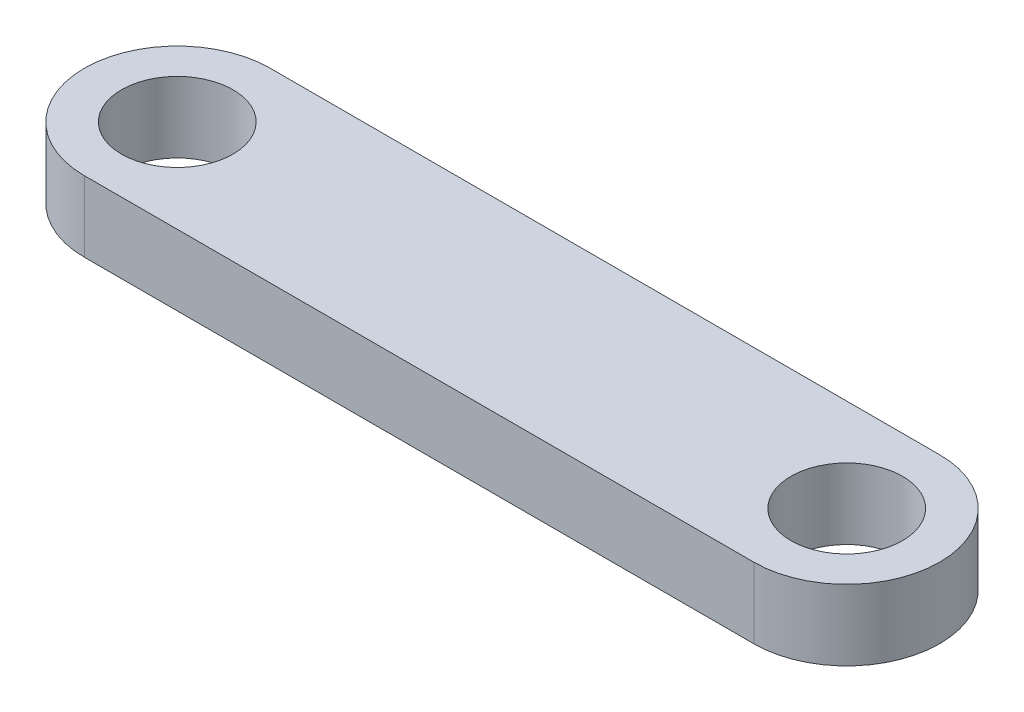
ISO-10303-21;
HEADER;
FILE_DESCRIPTION(('STEP AP214'),'2;1');
FILE_NAME('part.step','',(''),(''),'','','');
FILE_SCHEMA(('AUTOMOTIVE_DESIGN { 1 0 10303 214 1 1 1 1 }'));
ENDSEC;
DATA;
#1=APPLICATION_CONTEXT('core data for automotive mechanical design processes');
#2=APPLICATION_PROTOCOL_DEFINITION('international standard','automotive_design',2000,#1);
#3=PRODUCT_CONTEXT('',#1,'mechanical');
#4=PRODUCT('Part','Part','',(#3));
#5=PRODUCT_RELATED_PRODUCT_CATEGORY('part','',(#4));
#6=PRODUCT_DEFINITION_FORMATION('','',#4);
#7=PRODUCT_DEFINITION_CONTEXT('part definition',#1,'design');
#8=PRODUCT_DEFINITION('design','',#6,#7);
#9=PRODUCT_DEFINITION_SHAPE('','',#8);
#10=(LENGTH_UNIT() NAMED_UNIT(*) SI_UNIT(.MILLI.,.METRE.));
#11=(NAMED_UNIT(*) PLANE_ANGLE_UNIT() SI_UNIT($,.RADIAN.));
#12=(NAMED_UNIT(*) SI_UNIT($,.STERADIAN.) SOLID_ANGLE_UNIT());
#13=UNCERTAINTY_MEASURE_WITH_UNIT(LENGTH_MEASURE(1.E-05),#10,'distance_accuracy_value','');
#14=(GEOMETRIC_REPRESENTATION_CONTEXT(3) GLOBAL_UNCERTAINTY_ASSIGNED_CONTEXT((#13)) GLOBAL_UNIT_ASSIGNED_CONTEXT((#10,
#11,#12)) REPRESENTATION_CONTEXT('',''));
#15=CARTESIAN_POINT('',(0.,0.,0.));
#16=DIRECTION('',(0.,0.,1.));
#17=DIRECTION('',(1.,0.,0.));
#18=AXIS2_PLACEMENT_3D('',#15,#16,#17);
#19=CARTESIAN_POINT('',(9.,1.9,0.));
#20=DIRECTION('',(0.,-1.,0.));
#21=DIRECTION('',(0.,0.,-1.));
#22=AXIS2_PLACEMENT_3D('',#19,#20,#21);
#23=CYLINDRICAL_SURFACE('',#22,2.5);
#24=CARTESIAN_POINT('',(9.,0.,0.));
#25=DIRECTION('',(0.,1.,0.));
#26=DIRECTION('',(0.,0.,1.));
#27=AXIS2_PLACEMENT_3D('',#24,#25,#26);
#28=CIRCLE('',#27,2.5);
#29=CARTESIAN_POINT('',(9.,0.,2.49999999999999));
#30=VERTEX_POINT('',#29);
#31=CARTESIAN_POINT('',(9.,0.,-2.50000000000001));
#32=VERTEX_POINT('',#31);
#33=EDGE_CURVE('E95',#30,#32,#28,.T.);
#34=ORIENTED_EDGE('',*,*,#33,.T.);
#35=DIRECTION('',(0.,-1.,0.));
#36=VECTOR('',#35,1.);
#37=CARTESIAN_POINT('',(9.,1.9,-2.50000000000001));
#38=LINE('',#37,#36);
#39=CARTESIAN_POINT('',(9.,1.9,-2.50000000000001));
#40=VERTEX_POINT('',#39);
#41=EDGE_CURVE('E11',#40,#32,#38,.T.);
#42=ORIENTED_EDGE('',*,*,#41,.F.);
#43=CARTESIAN_POINT('',(9.,1.9,0.));
#44=DIRECTION('',(0.,1.,0.));
#45=DIRECTION('',(0.,0.,1.));
#46=AXIS2_PLACEMENT_3D('',#43,#44,#45);
#47=CIRCLE('',#46,2.5);
#48=CARTESIAN_POINT('',(9.,1.9,2.49999999999999));
#49=VERTEX_POINT('',#48);
#50=EDGE_CURVE('E83',#49,#40,#47,.T.);
#51=ORIENTED_EDGE('',*,*,#50,.F.);
#52=DIRECTION('',(0.,-1.,0.));
#53=VECTOR('',#52,1.);
#54=CARTESIAN_POINT('',(9.,1.9,2.49999999999999));
#55=LINE('',#54,#53);
#56=EDGE_CURVE('E91',#49,#30,#55,.T.);
#57=ORIENTED_EDGE('',*,*,#56,.T.);
#58=EDGE_LOOP('',(#34,#42,#51,#57));
#59=FACE_BOUND('',#58,.T.);
#60=ADVANCED_FACE('F32',(#59),#23,.T.);
#61=CARTESIAN_POINT('',(9.,1.9,-2.50000000000001));
#62=DIRECTION('',(0.,0.,1.));
#63=DIRECTION('',(1.,0.,0.));
#64=AXIS2_PLACEMENT_3D('',#61,#62,#63);
#65=PLANE('',#64);
#66=DIRECTION('',(-1.,0.,0.));
#67=VECTOR('',#66,1.);
#68=CARTESIAN_POINT('',(9.,0.,-2.50000000000001));
#69=LINE('',#68,#67);
#70=CARTESIAN_POINT('',(-9.,0.,-2.5));
#71=VERTEX_POINT('',#70);
#72=EDGE_CURVE('E87',#32,#71,#69,.T.);
#73=ORIENTED_EDGE('',*,*,#72,.T.);
#74=DIRECTION('',(0.,-1.,0.));
#75=VECTOR('',#74,1.);
#76=CARTESIAN_POINT('',(-9.,1.9,-2.5));
#77=LINE('',#76,#75);
#78=CARTESIAN_POINT('',(-9.,1.9,-2.5));
#79=VERTEX_POINT('',#78);
#80=EDGE_CURVE('E40',#79,#71,#77,.T.);
#81=ORIENTED_EDGE('',*,*,#80,.F.);
#82=DIRECTION('',(-1.,0.,0.));
#83=VECTOR('',#82,1.);
#84=CARTESIAN_POINT('',(9.,1.9,-2.50000000000001));
#85=LINE('',#84,#83);
#86=EDGE_CURVE('E78',#40,#79,#85,.T.);
#87=ORIENTED_EDGE('',*,*,#86,.F.);
#88=ORIENTED_EDGE('',*,*,#41,.T.);
#89=EDGE_LOOP('',(#73,#81,#87,#88));
#90=FACE_BOUND('',#89,.T.);
#91=ADVANCED_FACE('F86',(#90),#65,.F.);
#92=CARTESIAN_POINT('',(-9.,1.9,0.));
#93=DIRECTION('',(0.,-1.,0.));
#94=DIRECTION('',(0.,0.,-1.));
#95=AXIS2_PLACEMENT_3D('',#92,#93,#94);
#96=CYLINDRICAL_SURFACE('',#95,2.5);
#97=CARTESIAN_POINT('',(-9.,0.,0.));
#98=DIRECTION('',(0.,1.,0.));
#99=DIRECTION('',(0.,0.,1.));
#100=AXIS2_PLACEMENT_3D('',#97,#98,#99);
#101=CIRCLE('',#100,2.5);
#102=CARTESIAN_POINT('',(-9.,0.,2.5));
#103=VERTEX_POINT('',#102);
#104=EDGE_CURVE('E65',#71,#103,#101,.T.);
#105=ORIENTED_EDGE('',*,*,#104,.T.);
#106=DIRECTION('',(0.,-1.,0.));
#107=VECTOR('',#106,1.);
#108=CARTESIAN_POINT('',(-9.,1.9,2.5));
#109=LINE('',#108,#107);
#110=CARTESIAN_POINT('',(-9.,1.9,2.5));
#111=VERTEX_POINT('',#110);
#112=EDGE_CURVE('E88',#111,#103,#109,.T.);
#113=ORIENTED_EDGE('',*,*,#112,.F.);
#114=CARTESIAN_POINT('',(-9.,1.9,0.));
#115=DIRECTION('',(0.,1.,0.));
#116=DIRECTION('',(0.,0.,1.));
#117=AXIS2_PLACEMENT_3D('',#114,#115,#116);
#118=CIRCLE('',#117,2.5);
#119=EDGE_CURVE('E81',#79,#111,#118,.T.);
#120=ORIENTED_EDGE('',*,*,#119,.F.);
#121=ORIENTED_EDGE('',*,*,#80,.T.);
#122=EDGE_LOOP('',(#105,#113,#120,#121));
#123=FACE_BOUND('',#122,.T.);
#124=ADVANCED_FACE('F89',(#123),#96,.T.);
#125=CARTESIAN_POINT('',(9.,1.9,2.49999999999999));
#126=DIRECTION('',(0.,0.,-1.));
#127=DIRECTION('',(-1.,0.,0.));
#128=AXIS2_PLACEMENT_3D('',#125,#126,#127);
#129=PLANE('',#128);
#130=DIRECTION('',(1.,0.,0.));
#131=VECTOR('',#130,1.);
#132=CARTESIAN_POINT('',(9.,0.,2.49999999999999));
#133=LINE('',#132,#131);
#134=EDGE_CURVE('E71',#103,#30,#133,.T.);
#135=ORIENTED_EDGE('',*,*,#134,.T.);
#136=ORIENTED_EDGE('',*,*,#56,.F.);
#137=DIRECTION('',(1.,0.,0.));
#138=VECTOR('',#137,1.);
#139=CARTESIAN_POINT('',(9.,1.9,2.49999999999999));
#140=LINE('',#139,#138);
#141=EDGE_CURVE('E48',#111,#49,#140,.T.);
#142=ORIENTED_EDGE('',*,*,#141,.F.);
#143=ORIENTED_EDGE('',*,*,#112,.T.);
#144=EDGE_LOOP('',(#135,#136,#142,#143));
#145=FACE_BOUND('',#144,.T.);
#146=ADVANCED_FACE('F103',(#145),#129,.F.);
#147=CARTESIAN_POINT('',(9.,1.9,0.));
#148=DIRECTION('',(0.,1.,0.));
#149=DIRECTION('',(0.,0.,1.));
#150=AXIS2_PLACEMENT_3D('',#147,#148,#149);
#151=PLANE('',#150);
#152=CARTESIAN_POINT('',(-9.,1.9,0.));
#153=DIRECTION('',(0.,1.,0.));
#154=DIRECTION('',(0.,0.,1.));
#155=AXIS2_PLACEMENT_3D('',#152,#153,#154);
#156=CIRCLE('',#155,1.5);
#157=CARTESIAN_POINT('',(-9.,1.9,1.5));
#158=VERTEX_POINT('',#157);
#159=EDGE_CURVE('E115',#158,#158,#156,.T.);
#160=ORIENTED_EDGE('',*,*,#159,.F.);
#161=EDGE_LOOP('',(#160));
#162=FACE_BOUND('',#161,.T.);
#163=CARTESIAN_POINT('',(9.,1.9,0.));
#164=DIRECTION('',(0.,1.,0.));
#165=DIRECTION('',(0.,0.,1.));
#166=AXIS2_PLACEMENT_3D('',#163,#164,#165);
#167=CIRCLE('',#166,1.5);
#168=CARTESIAN_POINT('',(9.,1.9,1.49999999999999));
#169=VERTEX_POINT('',#168);
#170=EDGE_CURVE('E109',#169,#169,#167,.T.);
#171=ORIENTED_EDGE('',*,*,#170,.F.);
#172=EDGE_LOOP('',(#171));
#173=FACE_BOUND('',#172,.T.);
#174=ORIENTED_EDGE('',*,*,#50,.T.);
#175=ORIENTED_EDGE('',*,*,#86,.T.);
#176=ORIENTED_EDGE('',*,*,#119,.T.);
#177=ORIENTED_EDGE('',*,*,#141,.T.);
#178=EDGE_LOOP('',(#174,#175,#176,#177));
#179=FACE_BOUND('',#178,.T.);
#180=ADVANCED_FACE('F79',(#162,#173,#179),#151,.T.);
#181=CARTESIAN_POINT('',(9.,0.,0.));
#182=DIRECTION('',(0.,1.,0.));
#183=DIRECTION('',(0.,0.,1.));
#184=AXIS2_PLACEMENT_3D('',#181,#182,#183);
#185=PLANE('',#184);
#186=CARTESIAN_POINT('',(-9.,0.,0.));
#187=DIRECTION('',(0.,1.,0.));
#188=DIRECTION('',(0.,0.,1.));
#189=AXIS2_PLACEMENT_3D('',#186,#187,#188);
#190=CIRCLE('',#189,1.5);
#191=CARTESIAN_POINT('',(-9.,0.,1.5));
#192=VERTEX_POINT('',#191);
#193=EDGE_CURVE('E112',#192,#192,#190,.T.);
#194=ORIENTED_EDGE('',*,*,#193,.T.);
#195=EDGE_LOOP('',(#194));
#196=FACE_BOUND('',#195,.T.);
#197=CARTESIAN_POINT('',(9.,0.,0.));
#198=DIRECTION('',(0.,1.,0.));
#199=DIRECTION('',(0.,0.,1.));
#200=AXIS2_PLACEMENT_3D('',#197,#198,#199);
#201=CIRCLE('',#200,1.5);
#202=CARTESIAN_POINT('',(9.,0.,1.49999999999999));
#203=VERTEX_POINT('',#202);
#204=EDGE_CURVE('E98',#203,#203,#201,.T.);
#205=ORIENTED_EDGE('',*,*,#204,.T.);
#206=EDGE_LOOP('',(#205));
#207=FACE_BOUND('',#206,.T.);
#208=ORIENTED_EDGE('',*,*,#33,.F.);
#209=ORIENTED_EDGE('',*,*,#134,.F.);
#210=ORIENTED_EDGE('',*,*,#104,.F.);
#211=ORIENTED_EDGE('',*,*,#72,.F.);
#212=EDGE_LOOP('',(#208,#209,#210,#211));
#213=FACE_BOUND('',#212,.T.);
#214=ADVANCED_FACE('F106',(#196,#207,#213),#185,.F.);
#215=CARTESIAN_POINT('',(9.,0.,0.));
#216=DIRECTION('',(0.,1.,0.));
#217=DIRECTION('',(0.,0.,1.));
#218=AXIS2_PLACEMENT_3D('',#215,#216,#217);
#219=CYLINDRICAL_SURFACE('',#218,1.5);
#220=CARTESIAN_POINT('',(9.,0.,1.49999999999999));
#221=CARTESIAN_POINT('',(9.,0.0197916666666666,1.49999999999999));
#222=CARTESIAN_POINT('',(9.,0.0395833333333333,1.49999999999999));
#223=CARTESIAN_POINT('',(9.,0.0791666666666667,1.49999999999999));
#224=CARTESIAN_POINT('',(9.,0.0989583333333333,1.49999999999999));
#225=CARTESIAN_POINT('',(9.,0.138541666666667,1.49999999999999));
#226=CARTESIAN_POINT('',(9.,0.158333333333333,1.49999999999999));
#227=CARTESIAN_POINT('',(9.,0.197916666666667,1.49999999999999));
#228=CARTESIAN_POINT('',(9.,0.217708333333333,1.49999999999999));
#229=CARTESIAN_POINT('',(9.,0.257291666666667,1.49999999999999));
#230=CARTESIAN_POINT('',(9.,0.277083333333333,1.49999999999999));
#231=CARTESIAN_POINT('',(9.,0.316666666666667,1.49999999999999));
#232=CARTESIAN_POINT('',(9.,0.336458333333333,1.49999999999999));
#233=CARTESIAN_POINT('',(9.,0.376041666666667,1.49999999999999));
#234=CARTESIAN_POINT('',(9.,0.395833333333333,1.49999999999999));
#235=CARTESIAN_POINT('',(9.,0.435416666666667,1.49999999999999));
#236=CARTESIAN_POINT('',(9.,0.455208333333333,1.49999999999999));
#237=CARTESIAN_POINT('',(9.,0.494791666666667,1.49999999999999));
#238=CARTESIAN_POINT('',(9.,0.514583333333333,1.49999999999999));
#239=CARTESIAN_POINT('',(9.,0.554166666666667,1.49999999999999));
#240=CARTESIAN_POINT('',(9.,0.573958333333333,1.49999999999999));
#241=CARTESIAN_POINT('',(9.,0.613541666666667,1.49999999999999));
#242=CARTESIAN_POINT('',(9.,0.633333333333333,1.49999999999999));
#243=CARTESIAN_POINT('',(9.,0.672916666666667,1.49999999999999));
#244=CARTESIAN_POINT('',(9.,0.692708333333333,1.49999999999999));
#245=CARTESIAN_POINT('',(9.,0.732291666666667,1.49999999999999));
#246=CARTESIAN_POINT('',(9.,0.752083333333333,1.49999999999999));
#247=CARTESIAN_POINT('',(9.,0.791666666666667,1.49999999999999));
#248=CARTESIAN_POINT('',(9.,0.811458333333333,1.49999999999999));
#249=CARTESIAN_POINT('',(9.,0.851041666666667,1.49999999999999));
#250=CARTESIAN_POINT('',(9.,0.870833333333333,1.49999999999999));
#251=CARTESIAN_POINT('',(9.,0.910416666666667,1.49999999999999));
#252=CARTESIAN_POINT('',(9.,0.930208333333333,1.49999999999999));
#253=CARTESIAN_POINT('',(9.,0.969791666666667,1.49999999999999));
#254=CARTESIAN_POINT('',(9.,0.989583333333333,1.49999999999999));
#255=CARTESIAN_POINT('',(9.,1.02916666666667,1.49999999999999));
#256=CARTESIAN_POINT('',(9.,1.04895833333333,1.49999999999999));
#257=CARTESIAN_POINT('',(9.,1.08854166666667,1.49999999999999));
#258=CARTESIAN_POINT('',(9.,1.10833333333333,1.49999999999999));
#259=CARTESIAN_POINT('',(9.,1.14791666666667,1.49999999999999));
#260=CARTESIAN_POINT('',(9.,1.16770833333333,1.49999999999999));
#261=CARTESIAN_POINT('',(9.,1.20729166666667,1.49999999999999));
#262=CARTESIAN_POINT('',(9.,1.22708333333333,1.49999999999999));
#263=CARTESIAN_POINT('',(9.,1.26666666666667,1.49999999999999));
#264=CARTESIAN_POINT('',(9.,1.28645833333333,1.49999999999999));
#265=CARTESIAN_POINT('',(9.,1.32604166666667,1.49999999999999));
#266=CARTESIAN_POINT('',(9.,1.34583333333333,1.49999999999999));
#267=CARTESIAN_POINT('',(9.,1.38541666666667,1.49999999999999));
#268=CARTESIAN_POINT('',(9.,1.40520833333333,1.49999999999999));
#269=CARTESIAN_POINT('',(9.,1.44479166666667,1.49999999999999));
#270=CARTESIAN_POINT('',(9.,1.46458333333333,1.49999999999999));
#271=CARTESIAN_POINT('',(9.,1.50416666666667,1.49999999999999));
#272=CARTESIAN_POINT('',(9.,1.52395833333333,1.49999999999999));
#273=CARTESIAN_POINT('',(9.,1.56354166666667,1.49999999999999));
#274=CARTESIAN_POINT('',(9.,1.58333333333333,1.49999999999999));
#275=CARTESIAN_POINT('',(9.,1.62291666666667,1.49999999999999));
#276=CARTESIAN_POINT('',(9.,1.64270833333333,1.49999999999999));
#277=CARTESIAN_POINT('',(9.,1.68229166666667,1.49999999999999));
#278=CARTESIAN_POINT('',(9.,1.70208333333333,1.49999999999999));
#279=CARTESIAN_POINT('',(9.,1.74166666666667,1.49999999999999));
#280=CARTESIAN_POINT('',(9.,1.76145833333333,1.49999999999999));
#281=CARTESIAN_POINT('',(9.,1.80104166666667,1.49999999999999));
#282=CARTESIAN_POINT('',(9.,1.82083333333333,1.49999999999999));
#283=CARTESIAN_POINT('',(9.,1.86041666666667,1.49999999999999));
#284=CARTESIAN_POINT('',(9.,1.88020833333333,1.49999999999999));
#285=CARTESIAN_POINT('',(9.,1.9,1.49999999999999));
#286=B_SPLINE_CURVE_WITH_KNOTS('',3,(#220,#221,#222,#223,#224,#225,#226,#227,#228,#229,#230,
#231,#232,#233,#234,#235,#236,#237,#238,#239,#240,#241,#242,#243,#244,#245,#246,#247,#248,#249,
#250,#251,#252,#253,#254,#255,#256,#257,#258,#259,#260,#261,#262,#263,#264,#265,#266,#267,#268,
#269,#270,#271,#272,#273,#274,#275,#276,#277,#278,#279,#280,#281,#282,#283,#284,#285),
.UNSPECIFIED.,.F.,.F.,(4,2,2,2,2,2,2,2,2,2,2,2,2,2,2,2,2,2,2,2,2,2,2,2,2,2,2,2,2,2,2,2,4),(0.,
0.059375,0.11875,0.178125,0.2375,0.296875,0.35625,0.415625,0.475,0.534375,0.59375,0.653125,
0.7125,0.771875,0.83125,0.890625,0.95,1.009375,1.06875,1.128125,1.1875,1.246875,1.30625,
1.365625,1.425,1.484375,1.54375,1.603125,1.6625,1.721875,1.78125,1.840625,1.9),.UNSPECIFIED.);
#287=EDGE_CURVE('BSEAM126',#203,#169,#286,.T.);
#288=ORIENTED_EDGE('',*,*,#204,.F.);
#289=ORIENTED_EDGE('',*,*,#170,.T.);
#290=ORIENTED_EDGE('',*,*,#287,.T.);
#291=ORIENTED_EDGE('',*,*,#287,.F.);
#292=EDGE_LOOP('',(#288,#290,#289,#291));
#293=FACE_BOUND('',#292,.T.);
#294=ADVANCED_FACE('F126',(#293),#219,.F.);
#295=CARTESIAN_POINT('',(-9.,0.,0.));
#296=DIRECTION('',(0.,1.,0.));
#297=DIRECTION('',(0.,0.,1.));
#298=AXIS2_PLACEMENT_3D('',#295,#296,#297);
#299=CYLINDRICAL_SURFACE('',#298,1.5);
#300=CARTESIAN_POINT('',(-9.,0.,1.5));
#301=CARTESIAN_POINT('',(-9.,0.0197916666666666,1.5));
#302=CARTESIAN_POINT('',(-9.,0.0395833333333333,1.5));
#303=CARTESIAN_POINT('',(-9.,0.0791666666666667,1.5));
#304=CARTESIAN_POINT('',(-9.,0.0989583333333333,1.5));
#305=CARTESIAN_POINT('',(-9.,0.138541666666667,1.5));
#306=CARTESIAN_POINT('',(-9.,0.158333333333333,1.5));
#307=CARTESIAN_POINT('',(-9.,0.197916666666667,1.5));
#308=CARTESIAN_POINT('',(-9.,0.217708333333333,1.5));
#309=CARTESIAN_POINT('',(-9.,0.257291666666667,1.5));
#310=CARTESIAN_POINT('',(-9.,0.277083333333333,1.5));
#311=CARTESIAN_POINT('',(-9.,0.316666666666667,1.5));
#312=CARTESIAN_POINT('',(-9.,0.336458333333333,1.5));
#313=CARTESIAN_POINT('',(-9.,0.376041666666667,1.5));
#314=CARTESIAN_POINT('',(-9.,0.395833333333333,1.5));
#315=CARTESIAN_POINT('',(-9.,0.435416666666667,1.5));
#316=CARTESIAN_POINT('',(-9.,0.455208333333333,1.5));
#317=CARTESIAN_POINT('',(-9.,0.494791666666667,1.5));
#318=CARTESIAN_POINT('',(-9.,0.514583333333333,1.5));
#319=CARTESIAN_POINT('',(-9.,0.554166666666667,1.5));
#320=CARTESIAN_POINT('',(-9.,0.573958333333333,1.5));
#321=CARTESIAN_POINT('',(-9.,0.613541666666667,1.5));
#322=CARTESIAN_POINT('',(-9.,0.633333333333333,1.5));
#323=CARTESIAN_POINT('',(-9.,0.672916666666667,1.5));
#324=CARTESIAN_POINT('',(-9.,0.692708333333333,1.5));
#325=CARTESIAN_POINT('',(-9.,0.732291666666667,1.5));
#326=CARTESIAN_POINT('',(-9.,0.752083333333333,1.5));
#327=CARTESIAN_POINT('',(-9.,0.791666666666667,1.5));
#328=CARTESIAN_POINT('',(-9.,0.811458333333333,1.5));
#329=CARTESIAN_POINT('',(-9.,0.851041666666667,1.5));
#330=CARTESIAN_POINT('',(-9.,0.870833333333333,1.5));
#331=CARTESIAN_POINT('',(-9.,0.910416666666667,1.5));
#332=CARTESIAN_POINT('',(-9.,0.930208333333333,1.5));
#333=CARTESIAN_POINT('',(-9.,0.969791666666667,1.5));
#334=CARTESIAN_POINT('',(-9.,0.989583333333333,1.5));
#335=CARTESIAN_POINT('',(-9.,1.02916666666667,1.5));
#336=CARTESIAN_POINT('',(-9.,1.04895833333333,1.5));
#337=CARTESIAN_POINT('',(-9.,1.08854166666667,1.5));
#338=CARTESIAN_POINT('',(-9.,1.10833333333333,1.5));
#339=CARTESIAN_POINT('',(-9.,1.14791666666667,1.5));
#340=CARTESIAN_POINT('',(-9.,1.16770833333333,1.5));
#341=CARTESIAN_POINT('',(-9.,1.20729166666667,1.5));
#342=CARTESIAN_POINT('',(-9.,1.22708333333333,1.5));
#343=CARTESIAN_POINT('',(-9.,1.26666666666667,1.5));
#344=CARTESIAN_POINT('',(-9.,1.28645833333333,1.5));
#345=CARTESIAN_POINT('',(-9.,1.32604166666667,1.5));
#346=CARTESIAN_POINT('',(-9.,1.34583333333333,1.5));
#347=CARTESIAN_POINT('',(-9.,1.38541666666667,1.5));
#348=CARTESIAN_POINT('',(-9.,1.40520833333333,1.5));
#349=CARTESIAN_POINT('',(-9.,1.44479166666667,1.5));
#350=CARTESIAN_POINT('',(-9.,1.46458333333333,1.5));
#351=CARTESIAN_POINT('',(-9.,1.50416666666667,1.5));
#352=CARTESIAN_POINT('',(-9.,1.52395833333333,1.5));
#353=CARTESIAN_POINT('',(-9.,1.56354166666667,1.5));
#354=CARTESIAN_POINT('',(-9.,1.58333333333333,1.5));
#355=CARTESIAN_POINT('',(-9.,1.62291666666667,1.5));
#356=CARTESIAN_POINT('',(-9.,1.64270833333333,1.5));
#357=CARTESIAN_POINT('',(-9.,1.68229166666667,1.5));
#358=CARTESIAN_POINT('',(-9.,1.70208333333333,1.5));
#359=CARTESIAN_POINT('',(-9.,1.74166666666667,1.5));
#360=CARTESIAN_POINT('',(-9.,1.76145833333333,1.5));
#361=CARTESIAN_POINT('',(-9.,1.80104166666667,1.5));
#362=CARTESIAN_POINT('',(-9.,1.82083333333333,1.5));
#363=CARTESIAN_POINT('',(-9.,1.86041666666667,1.5));
#364=CARTESIAN_POINT('',(-9.,1.88020833333333,1.5));
#365=CARTESIAN_POINT('',(-9.,1.9,1.5));
#366=B_SPLINE_CURVE_WITH_KNOTS('',3,(#300,#301,#302,#303,#304,#305,#306,#307,#308,#309,#310,
#311,#312,#313,#314,#315,#316,#317,#318,#319,#320,#321,#322,#323,#324,#325,#326,#327,#328,#329,
#330,#331,#332,#333,#334,#335,#336,#337,#338,#339,#340,#341,#342,#343,#344,#345,#346,#347,#348,
#349,#350,#351,#352,#353,#354,#355,#356,#357,#358,#359,#360,#361,#362,#363,#364,#365),
.UNSPECIFIED.,.F.,.F.,(4,2,2,2,2,2,2,2,2,2,2,2,2,2,2,2,2,2,2,2,2,2,2,2,2,2,2,2,2,2,2,2,4),(0.,
0.059375,0.11875,0.178125,0.2375,0.296875,0.35625,0.415625,0.475,0.534375,0.59375,0.653125,
0.7125,0.771875,0.83125,0.890625,0.95,1.009375,1.06875,1.128125,1.1875,1.246875,1.30625,
1.365625,1.425,1.484375,1.54375,1.603125,1.6625,1.721875,1.78125,1.840625,1.9),.UNSPECIFIED.);
#367=EDGE_CURVE('BSEAM123',#192,#158,#366,.T.);
#368=ORIENTED_EDGE('',*,*,#193,.F.);
#369=ORIENTED_EDGE('',*,*,#159,.T.);
#370=ORIENTED_EDGE('',*,*,#367,.T.);
#371=ORIENTED_EDGE('',*,*,#367,.F.);
#372=EDGE_LOOP('',(#368,#370,#369,#371));
#373=FACE_BOUND('',#372,.T.);
#374=ADVANCED_FACE('F123',(#373),#299,.F.);
#375=CLOSED_SHELL('',(#60,#91,#124,#146,#180,#214,#294,#374));
#376=MANIFOLD_SOLID_BREP('B2',#375);
#377=ADVANCED_BREP_SHAPE_REPRESENTATION('',(#18,#376),#14);
#378=SHAPE_DEFINITION_REPRESENTATION(#9,#377);
ENDSEC;
END-ISO-10303-21;
